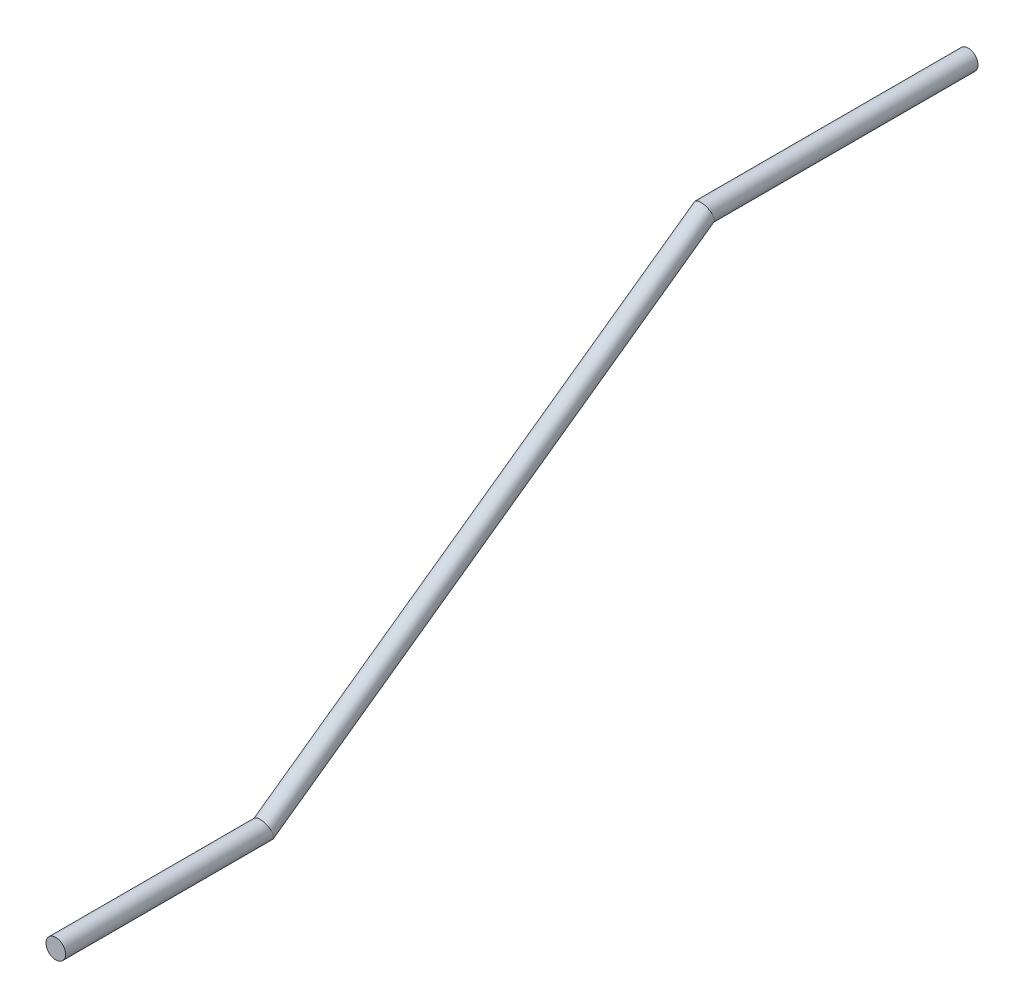
ISO-10303-21;
HEADER;
FILE_DESCRIPTION(('STEP AP214'),'2;1');
FILE_NAME('part.step','',(''),(''),'','','');
FILE_SCHEMA(('AUTOMOTIVE_DESIGN { 1 0 10303 214 1 1 1 1 }'));
ENDSEC;
DATA;
#1=APPLICATION_CONTEXT('core data for automotive mechanical design processes');
#2=APPLICATION_PROTOCOL_DEFINITION('international standard','automotive_design',2000,#1);
#3=PRODUCT_CONTEXT('',#1,'mechanical');
#4=PRODUCT('Part','Part','',(#3));
#5=PRODUCT_RELATED_PRODUCT_CATEGORY('part','',(#4));
#6=PRODUCT_DEFINITION_FORMATION('','',#4);
#7=PRODUCT_DEFINITION_CONTEXT('part definition',#1,'design');
#8=PRODUCT_DEFINITION('design','',#6,#7);
#9=PRODUCT_DEFINITION_SHAPE('','',#8);
#10=(LENGTH_UNIT() NAMED_UNIT(*) SI_UNIT(.MILLI.,.METRE.));
#11=(NAMED_UNIT(*) PLANE_ANGLE_UNIT() SI_UNIT($,.RADIAN.));
#12=(NAMED_UNIT(*) SI_UNIT($,.STERADIAN.) SOLID_ANGLE_UNIT());
#13=UNCERTAINTY_MEASURE_WITH_UNIT(LENGTH_MEASURE(1.E-05),#10,'distance_accuracy_value','');
#14=(GEOMETRIC_REPRESENTATION_CONTEXT(3) GLOBAL_UNCERTAINTY_ASSIGNED_CONTEXT((#13)) GLOBAL_UNIT_ASSIGNED_CONTEXT((#10,
#11,#12)) REPRESENTATION_CONTEXT('',''));
#15=CARTESIAN_POINT('',(0.,0.,0.));
#16=DIRECTION('',(0.,0.,1.));
#17=DIRECTION('',(1.,0.,0.));
#18=AXIS2_PLACEMENT_3D('',#15,#16,#17);
#19=CARTESIAN_POINT('',(13.9077398890124,5.61914327807837,38.7099336884413));
#20=DIRECTION('',(0.,0.,-1.));
#21=DIRECTION('',(-1.,0.,0.));
#22=AXIS2_PLACEMENT_3D('',#19,#20,#21);
#23=PLANE('',#22);
#24=CARTESIAN_POINT('',(13.9077398890124,5.61914327807837,38.7099336884413));
#25=DIRECTION('',(0.,0.,-1.));
#26=DIRECTION('',(-1.,0.,0.));
#27=AXIS2_PLACEMENT_3D('',#24,#25,#26);
#28=CIRCLE('',#27,0.6);
#29=CARTESIAN_POINT('',(13.3077398890124,5.61914327807837,38.7099336884413));
#30=VERTEX_POINT('',#29);
#31=EDGE_CURVE('E46',#30,#30,#28,.T.);
#32=ORIENTED_EDGE('',*,*,#31,.F.);
#33=EDGE_LOOP('',(#32));
#34=FACE_BOUND('',#33,.T.);
#35=ADVANCED_FACE('F43',(#34),#23,.F.);
#36=CARTESIAN_POINT('',(15.,25.9807621135332,-16.2));
#37=DIRECTION('',(0.,0.,-1.));
#38=DIRECTION('',(-1.,0.,0.));
#39=AXIS2_PLACEMENT_3D('',#36,#37,#38);
#40=PLANE('',#39);
#41=CARTESIAN_POINT('',(15.,25.9807621135332,-16.2));
#42=DIRECTION('',(0.,0.,-1.));
#43=DIRECTION('',(-1.,0.,0.));
#44=AXIS2_PLACEMENT_3D('',#41,#42,#43);
#45=CIRCLE('',#44,0.6);
#46=CARTESIAN_POINT('',(14.4,25.9807621135332,-16.2));
#47=VERTEX_POINT('',#46);
#48=EDGE_CURVE('E49',#47,#47,#45,.T.);
#49=ORIENTED_EDGE('',*,*,#48,.T.);
#50=EDGE_LOOP('',(#49));
#51=FACE_BOUND('',#50,.T.);
#52=ADVANCED_FACE('F66',(#51),#40,.T.);
#53=CARTESIAN_POINT('',(13.9077398890124,5.61914327807837,25.3919342114107));
#54=DIRECTION('',(0.,0.,1.));
#55=DIRECTION('',(1.,0.,0.));
#56=AXIS2_PLACEMENT_3D('',#53,#54,#55);
#57=CYLINDRICAL_SURFACE('',#56,0.6);
#58=CARTESIAN_POINT('',(13.9077398890124,5.61914327807836,25.9599336884413));
#59=DIRECTION('',(-0.0175051465117297,-0.326326227008649,0.945095108130342));
#60=DIRECTION('',(-0.0506250335627067,-0.943738241986981,-0.326795404784243));
#61=AXIS2_PLACEMENT_3D('',#58,#59,#60);
#62=ELLIPSE('',#61,0.634856740700907,0.6);
#63=CARTESIAN_POINT('',(13.8756002452069,5.0200046936957,25.7524654228839));
#64=VERTEX_POINT('',#63);
#65=EDGE_CURVE('E54',#64,#64,#62,.T.);
#66=ORIENTED_EDGE('',*,*,#65,.T.);
#67=EDGE_LOOP('',(#66));
#68=FACE_BOUND('',#67,.T.);
#69=ORIENTED_EDGE('',*,*,#31,.T.);
#70=EDGE_LOOP('',(#69));
#71=FACE_BOUND('',#70,.T.);
#72=ADVANCED_FACE('F64',(#68,#71),#57,.T.);
#73=CARTESIAN_POINT('',(15.0187939988849,26.3311147793852,-0.44668019996779));
#74=DIRECTION('',(-0.0330880566706813,-0.616818641601011,0.786409526823805));
#75=DIRECTION('',(0.,-0.786840368867012,-0.617156571642257));
#76=AXIS2_PLACEMENT_3D('',#73,#74,#75);
#77=CYLINDRICAL_SURFACE('',#76,0.6);
#78=CARTESIAN_POINT('',(15.,25.9807621135332,0.));
#79=DIRECTION('',(-0.0175051465117297,-0.326326227008649,0.945095108130342));
#80=DIRECTION('',(0.0506250335627067,0.943738241986981,0.326795404784244));
#81=AXIS2_PLACEMENT_3D('',#78,#79,#80);
#82=ELLIPSE('',#81,0.634856740700907,0.6);
#83=CARTESIAN_POINT('',(15.0321396438055,26.5799006979158,0.207468265557362));
#84=VERTEX_POINT('',#83);
#85=EDGE_CURVE('E11',#84,#84,#82,.T.);
#86=ORIENTED_EDGE('',*,*,#85,.T.);
#87=EDGE_LOOP('',(#86));
#88=FACE_BOUND('',#87,.T.);
#89=ORIENTED_EDGE('',*,*,#65,.F.);
#90=EDGE_LOOP('',(#89));
#91=FACE_BOUND('',#90,.T.);
#92=ADVANCED_FACE('F75',(#88,#91),#77,.T.);
#93=CARTESIAN_POINT('',(15.,25.9807621135332,-16.2));
#94=DIRECTION('',(0.,0.,1.));
#95=DIRECTION('',(1.,0.,0.));
#96=AXIS2_PLACEMENT_3D('',#93,#94,#95);
#97=CYLINDRICAL_SURFACE('',#96,0.6);
#98=ORIENTED_EDGE('',*,*,#48,.F.);
#99=EDGE_LOOP('',(#98));
#100=FACE_BOUND('',#99,.T.);
#101=ORIENTED_EDGE('',*,*,#85,.F.);
#102=EDGE_LOOP('',(#101));
#103=FACE_BOUND('',#102,.T.);
#104=ADVANCED_FACE('F72',(#100,#103),#97,.T.);
#105=CLOSED_SHELL('',(#35,#52,#72,#92,#104));
#106=MANIFOLD_SOLID_BREP('B2',#105);
#107=ADVANCED_BREP_SHAPE_REPRESENTATION('',(#18,#106),#14);
#108=SHAPE_DEFINITION_REPRESENTATION(#9,#107);
ENDSEC;
END-ISO-10303-21;
